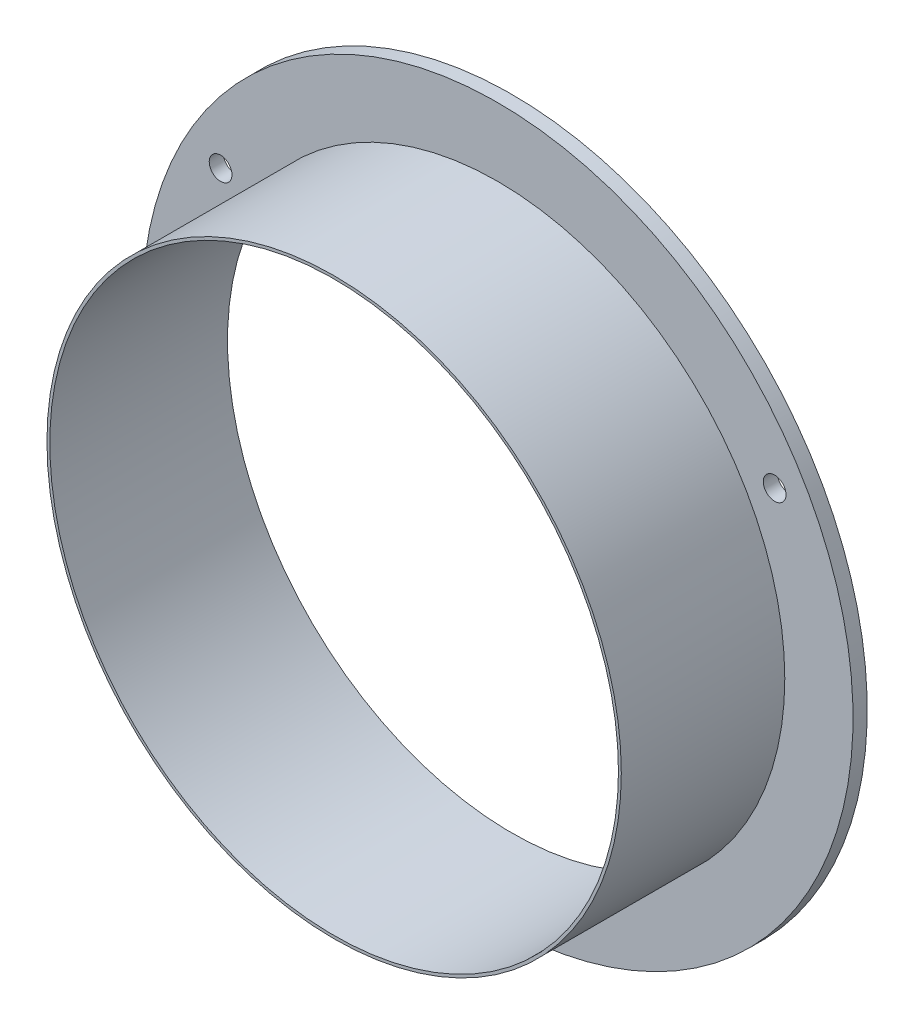
ISO-10303-21;
HEADER;
FILE_DESCRIPTION(('STEP AP214'),'2;1');
FILE_NAME('part.step','',(''),(''),'','','');
FILE_SCHEMA(('AUTOMOTIVE_DESIGN { 1 0 10303 214 1 1 1 1 }'));
ENDSEC;
DATA;
#1=APPLICATION_CONTEXT('core data for automotive mechanical design processes');
#2=APPLICATION_PROTOCOL_DEFINITION('international standard','automotive_design',2000,#1);
#3=PRODUCT_CONTEXT('',#1,'mechanical');
#4=PRODUCT('Part','Part','',(#3));
#5=PRODUCT_RELATED_PRODUCT_CATEGORY('part','',(#4));
#6=PRODUCT_DEFINITION_FORMATION('','',#4);
#7=PRODUCT_DEFINITION_CONTEXT('part definition',#1,'design');
#8=PRODUCT_DEFINITION('design','',#6,#7);
#9=PRODUCT_DEFINITION_SHAPE('','',#8);
#10=(LENGTH_UNIT() NAMED_UNIT(*) SI_UNIT(.MILLI.,.METRE.));
#11=(NAMED_UNIT(*) PLANE_ANGLE_UNIT() SI_UNIT($,.RADIAN.));
#12=(NAMED_UNIT(*) SI_UNIT($,.STERADIAN.) SOLID_ANGLE_UNIT());
#13=UNCERTAINTY_MEASURE_WITH_UNIT(LENGTH_MEASURE(1.E-05),#10,'distance_accuracy_value','');
#14=(GEOMETRIC_REPRESENTATION_CONTEXT(3) GLOBAL_UNCERTAINTY_ASSIGNED_CONTEXT((#13)) GLOBAL_UNIT_ASSIGNED_CONTEXT((#10,
#11,#12)) REPRESENTATION_CONTEXT('',''));
#15=CARTESIAN_POINT('',(0.,0.,0.));
#16=DIRECTION('',(0.,0.,1.));
#17=DIRECTION('',(1.,0.,0.));
#18=AXIS2_PLACEMENT_3D('',#15,#16,#17);
#19=CARTESIAN_POINT('',(0.,0.,-25.));
#20=DIRECTION('',(0.,0.,1.));
#21=DIRECTION('',(1.,0.,0.));
#22=AXIS2_PLACEMENT_3D('',#19,#20,#21);
#23=CYLINDRICAL_SURFACE('',#22,40.4);
#24=CARTESIAN_POINT('',(0.,0.,0.));
#25=DIRECTION('',(0.,0.,1.));
#26=DIRECTION('',(1.,0.,0.));
#27=AXIS2_PLACEMENT_3D('',#24,#25,#26);
#28=CIRCLE('',#27,40.4);
#29=CARTESIAN_POINT('',(40.4,0.,0.));
#30=VERTEX_POINT('',#29);
#31=EDGE_CURVE('E10',#30,#30,#28,.T.);
#32=ORIENTED_EDGE('',*,*,#31,.F.);
#33=EDGE_LOOP('',(#32));
#34=FACE_BOUND('',#33,.T.);
#35=CARTESIAN_POINT('',(0.,0.,-23.));
#36=DIRECTION('',(0.,0.,-1.));
#37=DIRECTION('',(-1.,0.,0.));
#38=AXIS2_PLACEMENT_3D('',#35,#36,#37);
#39=CIRCLE('',#38,40.4);
#40=CARTESIAN_POINT('',(-40.4,0.,-23.));
#41=VERTEX_POINT('',#40);
#42=EDGE_CURVE('E46',#41,#41,#39,.F.);
#43=ORIENTED_EDGE('',*,*,#42,.T.);
#44=EDGE_LOOP('',(#43));
#45=FACE_BOUND('',#44,.T.);
#46=ADVANCED_FACE('F31',(#34,#45),#23,.T.);
#47=CARTESIAN_POINT('',(0.,0.,-25.));
#48=DIRECTION('',(0.,0.,1.));
#49=DIRECTION('',(1.,0.,0.));
#50=AXIS2_PLACEMENT_3D('',#47,#48,#49);
#51=PLANE('',#50);
#52=CARTESIAN_POINT('',(0.,0.,-25.));
#53=DIRECTION('',(0.,0.,1.));
#54=DIRECTION('',(1.,0.,0.));
#55=AXIS2_PLACEMENT_3D('',#52,#53,#54);
#56=CIRCLE('',#55,40.);
#57=CARTESIAN_POINT('',(40.,0.,-25.));
#58=VERTEX_POINT('',#57);
#59=EDGE_CURVE('E37',#58,#58,#56,.T.);
#60=ORIENTED_EDGE('',*,*,#59,.T.);
#61=EDGE_LOOP('',(#60));
#62=FACE_BOUND('',#61,.T.);
#63=CARTESIAN_POINT('',(0.,-45.,-25.));
#64=DIRECTION('',(0.,0.,-1.));
#65=DIRECTION('',(-1.,0.,0.));
#66=AXIS2_PLACEMENT_3D('',#63,#64,#65);
#67=CIRCLE('',#66,1.6);
#68=CARTESIAN_POINT('',(-1.59999999999999,-45.,-25.));
#69=VERTEX_POINT('',#68);
#70=EDGE_CURVE('E69',#69,#69,#67,.T.);
#71=ORIENTED_EDGE('',*,*,#70,.F.);
#72=EDGE_LOOP('',(#71));
#73=FACE_BOUND('',#72,.T.);
#74=CARTESIAN_POINT('',(38.9711431702998,22.5,-25.));
#75=DIRECTION('',(0.,0.,-1.));
#76=DIRECTION('',(-1.,0.,0.));
#77=AXIS2_PLACEMENT_3D('',#74,#75,#76);
#78=CIRCLE('',#77,1.6);
#79=CARTESIAN_POINT('',(37.3711431702998,22.5,-25.));
#80=VERTEX_POINT('',#79);
#81=EDGE_CURVE('E63',#80,#80,#78,.T.);
#82=ORIENTED_EDGE('',*,*,#81,.F.);
#83=EDGE_LOOP('',(#82));
#84=FACE_BOUND('',#83,.T.);
#85=CARTESIAN_POINT('',(-38.9711431702998,22.5,-25.));
#86=DIRECTION('',(0.,0.,-1.));
#87=DIRECTION('',(-1.,0.,0.));
#88=AXIS2_PLACEMENT_3D('',#85,#86,#87);
#89=CIRCLE('',#88,1.6);
#90=CARTESIAN_POINT('',(-40.5711431702998,22.5,-25.));
#91=VERTEX_POINT('',#90);
#92=EDGE_CURVE('E57',#91,#91,#89,.T.);
#93=ORIENTED_EDGE('',*,*,#92,.F.);
#94=EDGE_LOOP('',(#93));
#95=FACE_BOUND('',#94,.T.);
#96=CARTESIAN_POINT('',(0.,0.,-25.));
#97=DIRECTION('',(0.,0.,-1.));
#98=DIRECTION('',(-1.,0.,0.));
#99=AXIS2_PLACEMENT_3D('',#96,#97,#98);
#100=CIRCLE('',#99,50.);
#101=CARTESIAN_POINT('',(-50.,0.,-25.));
#102=VERTEX_POINT('',#101);
#103=EDGE_CURVE('E51',#102,#102,#100,.T.);
#104=ORIENTED_EDGE('',*,*,#103,.T.);
#105=EDGE_LOOP('',(#104));
#106=FACE_BOUND('',#105,.T.);
#107=ADVANCED_FACE('F85',(#62,#73,#84,#95,#106),#51,.F.);
#108=CARTESIAN_POINT('',(0.,0.,0.));
#109=DIRECTION('',(0.,0.,1.));
#110=DIRECTION('',(1.,0.,0.));
#111=AXIS2_PLACEMENT_3D('',#108,#109,#110);
#112=PLANE('',#111);
#113=CARTESIAN_POINT('',(0.,0.,0.));
#114=DIRECTION('',(0.,0.,1.));
#115=DIRECTION('',(1.,0.,0.));
#116=AXIS2_PLACEMENT_3D('',#113,#114,#115);
#117=CIRCLE('',#116,40.);
#118=CARTESIAN_POINT('',(40.,0.,0.));
#119=VERTEX_POINT('',#118);
#120=EDGE_CURVE('E41',#119,#119,#117,.T.);
#121=ORIENTED_EDGE('',*,*,#120,.F.);
#122=EDGE_LOOP('',(#121));
#123=FACE_BOUND('',#122,.T.);
#124=ORIENTED_EDGE('',*,*,#31,.T.);
#125=EDGE_LOOP('',(#124));
#126=FACE_BOUND('',#125,.T.);
#127=ADVANCED_FACE('F88',(#123,#126),#112,.T.);
#128=CARTESIAN_POINT('',(0.,0.,-25.));
#129=DIRECTION('',(0.,0.,1.));
#130=DIRECTION('',(1.,0.,0.));
#131=AXIS2_PLACEMENT_3D('',#128,#129,#130);
#132=CYLINDRICAL_SURFACE('',#131,40.);
#133=ORIENTED_EDGE('',*,*,#59,.F.);
#134=EDGE_LOOP('',(#133));
#135=FACE_BOUND('',#134,.T.);
#136=ORIENTED_EDGE('',*,*,#120,.T.);
#137=EDGE_LOOP('',(#136));
#138=FACE_BOUND('',#137,.T.);
#139=ADVANCED_FACE('F98',(#135,#138),#132,.F.);
#140=CARTESIAN_POINT('',(0.,0.,-23.));
#141=DIRECTION('',(0.,0.,-1.));
#142=DIRECTION('',(-1.,0.,0.));
#143=AXIS2_PLACEMENT_3D('',#140,#141,#142);
#144=CYLINDRICAL_SURFACE('',#143,50.);
#145=CARTESIAN_POINT('',(0.,0.,-23.));
#146=DIRECTION('',(0.,0.,-1.));
#147=DIRECTION('',(-1.,0.,0.));
#148=AXIS2_PLACEMENT_3D('',#145,#146,#147);
#149=CIRCLE('',#148,50.);
#150=CARTESIAN_POINT('',(-50.,0.,-23.));
#151=VERTEX_POINT('',#150);
#152=EDGE_CURVE('E50',#151,#151,#149,.T.);
#153=ORIENTED_EDGE('',*,*,#152,.T.);
#154=EDGE_LOOP('',(#153));
#155=FACE_BOUND('',#154,.T.);
#156=ORIENTED_EDGE('',*,*,#103,.F.);
#157=EDGE_LOOP('',(#156));
#158=FACE_BOUND('',#157,.T.);
#159=ADVANCED_FACE('F96',(#155,#158),#144,.T.);
#160=CARTESIAN_POINT('',(0.,0.,-23.));
#161=DIRECTION('',(0.,0.,-1.));
#162=DIRECTION('',(-1.,0.,0.));
#163=AXIS2_PLACEMENT_3D('',#160,#161,#162);
#164=PLANE('',#163);
#165=ORIENTED_EDGE('',*,*,#42,.F.);
#166=EDGE_LOOP('',(#165));
#167=FACE_BOUND('',#166,.T.);
#168=CARTESIAN_POINT('',(0.,-45.,-23.));
#169=DIRECTION('',(0.,0.,-1.));
#170=DIRECTION('',(-1.,0.,0.));
#171=AXIS2_PLACEMENT_3D('',#168,#169,#170);
#172=CIRCLE('',#171,1.6);
#173=CARTESIAN_POINT('',(-1.59999999999999,-45.,-23.));
#174=VERTEX_POINT('',#173);
#175=EDGE_CURVE('E66',#174,#174,#172,.T.);
#176=ORIENTED_EDGE('',*,*,#175,.T.);
#177=EDGE_LOOP('',(#176));
#178=FACE_BOUND('',#177,.T.);
#179=CARTESIAN_POINT('',(38.9711431702998,22.5,-23.));
#180=DIRECTION('',(0.,0.,-1.));
#181=DIRECTION('',(-1.,0.,0.));
#182=AXIS2_PLACEMENT_3D('',#179,#180,#181);
#183=CIRCLE('',#182,1.6);
#184=CARTESIAN_POINT('',(37.3711431702998,22.5,-23.));
#185=VERTEX_POINT('',#184);
#186=EDGE_CURVE('E60',#185,#185,#183,.T.);
#187=ORIENTED_EDGE('',*,*,#186,.T.);
#188=EDGE_LOOP('',(#187));
#189=FACE_BOUND('',#188,.T.);
#190=CARTESIAN_POINT('',(-38.9711431702998,22.5,-23.));
#191=DIRECTION('',(0.,0.,-1.));
#192=DIRECTION('',(-1.,0.,0.));
#193=AXIS2_PLACEMENT_3D('',#190,#191,#192);
#194=CIRCLE('',#193,1.6);
#195=CARTESIAN_POINT('',(-40.5711431702998,22.5,-23.));
#196=VERTEX_POINT('',#195);
#197=EDGE_CURVE('E54',#196,#196,#194,.T.);
#198=ORIENTED_EDGE('',*,*,#197,.T.);
#199=EDGE_LOOP('',(#198));
#200=FACE_BOUND('',#199,.T.);
#201=ORIENTED_EDGE('',*,*,#152,.F.);
#202=EDGE_LOOP('',(#201));
#203=FACE_BOUND('',#202,.T.);
#204=ADVANCED_FACE('F75',(#167,#178,#189,#200,#203),#164,.F.);
#205=CARTESIAN_POINT('',(-38.9711431702998,22.5,-23.));
#206=DIRECTION('',(0.,0.,-1.));
#207=DIRECTION('',(-1.,0.,0.));
#208=AXIS2_PLACEMENT_3D('',#205,#206,#207);
#209=CYLINDRICAL_SURFACE('',#208,1.6);
#210=ORIENTED_EDGE('',*,*,#197,.F.);
#211=EDGE_LOOP('',(#210));
#212=FACE_BOUND('',#211,.T.);
#213=ORIENTED_EDGE('',*,*,#92,.T.);
#214=EDGE_LOOP('',(#213));
#215=FACE_BOUND('',#214,.T.);
#216=ADVANCED_FACE('F105',(#212,#215),#209,.F.);
#217=CARTESIAN_POINT('',(38.9711431702998,22.5,-23.));
#218=DIRECTION('',(0.,0.,-1.));
#219=DIRECTION('',(-1.,0.,0.));
#220=AXIS2_PLACEMENT_3D('',#217,#218,#219);
#221=CYLINDRICAL_SURFACE('',#220,1.6);
#222=ORIENTED_EDGE('',*,*,#186,.F.);
#223=EDGE_LOOP('',(#222));
#224=FACE_BOUND('',#223,.T.);
#225=ORIENTED_EDGE('',*,*,#81,.T.);
#226=EDGE_LOOP('',(#225));
#227=FACE_BOUND('',#226,.T.);
#228=ADVANCED_FACE('F81',(#224,#227),#221,.F.);
#229=CARTESIAN_POINT('',(0.,-45.,-23.));
#230=DIRECTION('',(0.,0.,-1.));
#231=DIRECTION('',(-1.,0.,0.));
#232=AXIS2_PLACEMENT_3D('',#229,#230,#231);
#233=CYLINDRICAL_SURFACE('',#232,1.6);
#234=ORIENTED_EDGE('',*,*,#175,.F.);
#235=EDGE_LOOP('',(#234));
#236=FACE_BOUND('',#235,.T.);
#237=ORIENTED_EDGE('',*,*,#70,.T.);
#238=EDGE_LOOP('',(#237));
#239=FACE_BOUND('',#238,.T.);
#240=ADVANCED_FACE('F78',(#236,#239),#233,.F.);
#241=CLOSED_SHELL('',(#46,#107,#127,#139,#159,#204,#216,#228,#240));
#242=MANIFOLD_SOLID_BREP('B2',#241);
#243=ADVANCED_BREP_SHAPE_REPRESENTATION('',(#18,#242),#14);
#244=SHAPE_DEFINITION_REPRESENTATION(#9,#243);
ENDSEC;
END-ISO-10303-21;
